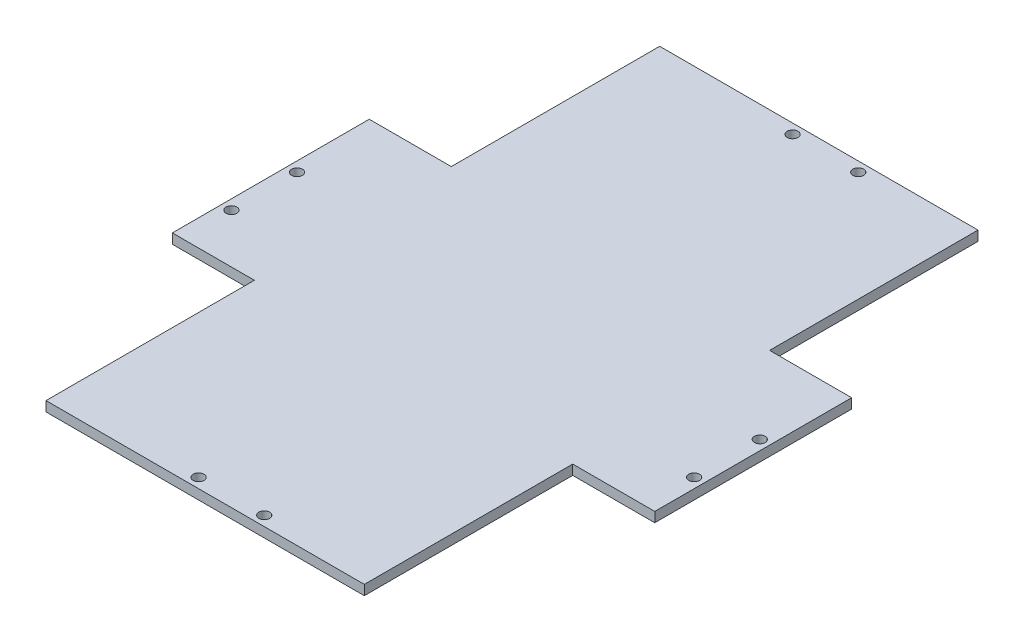
ISO-10303-21;
HEADER;
FILE_DESCRIPTION(('STEP AP214'),'2;1');
FILE_NAME('part.step','',(''),(''),'','','');
FILE_SCHEMA(('AUTOMOTIVE_DESIGN { 1 0 10303 214 1 1 1 1 }'));
ENDSEC;
DATA;
#1=APPLICATION_CONTEXT('core data for automotive mechanical design processes');
#2=APPLICATION_PROTOCOL_DEFINITION('international standard','automotive_design',2000,#1);
#3=PRODUCT_CONTEXT('',#1,'mechanical');
#4=PRODUCT('Part','Part','',(#3));
#5=PRODUCT_RELATED_PRODUCT_CATEGORY('part','',(#4));
#6=PRODUCT_DEFINITION_FORMATION('','',#4);
#7=PRODUCT_DEFINITION_CONTEXT('part definition',#1,'design');
#8=PRODUCT_DEFINITION('design','',#6,#7);
#9=PRODUCT_DEFINITION_SHAPE('','',#8);
#10=(LENGTH_UNIT() NAMED_UNIT(*) SI_UNIT(.MILLI.,.METRE.));
#11=(NAMED_UNIT(*) PLANE_ANGLE_UNIT() SI_UNIT($,.RADIAN.));
#12=(NAMED_UNIT(*) SI_UNIT($,.STERADIAN.) SOLID_ANGLE_UNIT());
#13=UNCERTAINTY_MEASURE_WITH_UNIT(LENGTH_MEASURE(1.E-05),#10,'distance_accuracy_value','');
#14=(GEOMETRIC_REPRESENTATION_CONTEXT(3) GLOBAL_UNCERTAINTY_ASSIGNED_CONTEXT((#13)) GLOBAL_UNIT_ASSIGNED_CONTEXT((#10,
#11,#12)) REPRESENTATION_CONTEXT('',''));
#15=CARTESIAN_POINT('',(0.,0.,0.));
#16=DIRECTION('',(0.,0.,1.));
#17=DIRECTION('',(1.,0.,0.));
#18=AXIS2_PLACEMENT_3D('',#15,#16,#17);
#19=CARTESIAN_POINT('',(-48.5,3.,93.5));
#20=DIRECTION('',(1.,0.,0.));
#21=DIRECTION('',(0.,0.,-1.));
#22=AXIS2_PLACEMENT_3D('',#19,#20,#21);
#23=PLANE('',#22);
#24=DIRECTION('',(0.,1.,0.));
#25=VECTOR('',#24,1.);
#26=CARTESIAN_POINT('',(-48.5,0.,30.));
#27=LINE('',#26,#25);
#28=CARTESIAN_POINT('',(-48.5,0.,30.));
#29=VERTEX_POINT('',#28);
#30=CARTESIAN_POINT('',(-48.5,3.,30.));
#31=VERTEX_POINT('',#30);
#32=EDGE_CURVE('E152',#29,#31,#27,.T.);
#33=ORIENTED_EDGE('',*,*,#32,.F.);
#34=DIRECTION('',(0.,0.,1.));
#35=VECTOR('',#34,1.);
#36=CARTESIAN_POINT('',(-48.5,0.,93.5));
#37=LINE('',#36,#35);
#38=CARTESIAN_POINT('',(-48.5,0.,93.5));
#39=VERTEX_POINT('',#38);
#40=EDGE_CURVE('E139',#29,#39,#37,.T.);
#41=ORIENTED_EDGE('',*,*,#40,.T.);
#42=DIRECTION('',(0.,-1.,0.));
#43=VECTOR('',#42,1.);
#44=CARTESIAN_POINT('',(-48.5,3.,93.5));
#45=LINE('',#44,#43);
#46=CARTESIAN_POINT('',(-48.5,3.,93.5));
#47=VERTEX_POINT('',#46);
#48=EDGE_CURVE('E220',#47,#39,#45,.T.);
#49=ORIENTED_EDGE('',*,*,#48,.F.);
#50=DIRECTION('',(0.,0.,1.));
#51=VECTOR('',#50,1.);
#52=CARTESIAN_POINT('',(-48.5,3.,93.5));
#53=LINE('',#52,#51);
#54=EDGE_CURVE('E201',#31,#47,#53,.T.);
#55=ORIENTED_EDGE('',*,*,#54,.F.);
#56=EDGE_LOOP('',(#33,#41,#49,#55));
#57=FACE_BOUND('',#56,.T.);
#58=ADVANCED_FACE('F41',(#57),#23,.F.);
#59=CARTESIAN_POINT('',(48.5,3.,93.5));
#60=DIRECTION('',(-1.,0.,0.));
#61=DIRECTION('',(0.,0.,1.));
#62=AXIS2_PLACEMENT_3D('',#59,#60,#61);
#63=PLANE('',#62);
#64=DIRECTION('',(0.,1.,0.));
#65=VECTOR('',#64,1.);
#66=CARTESIAN_POINT('',(48.5,0.,-30.));
#67=LINE('',#66,#65);
#68=CARTESIAN_POINT('',(48.5,0.,-30.));
#69=VERTEX_POINT('',#68);
#70=CARTESIAN_POINT('',(48.5,3.,-30.));
#71=VERTEX_POINT('',#70);
#72=EDGE_CURVE('E192',#69,#71,#67,.T.);
#73=ORIENTED_EDGE('',*,*,#72,.F.);
#74=DIRECTION('',(0.,0.,-1.));
#75=VECTOR('',#74,1.);
#76=CARTESIAN_POINT('',(48.5,0.,93.5));
#77=LINE('',#76,#75);
#78=CARTESIAN_POINT('',(48.5,0.,-93.5));
#79=VERTEX_POINT('',#78);
#80=EDGE_CURVE('E189',#69,#79,#77,.T.);
#81=ORIENTED_EDGE('',*,*,#80,.T.);
#82=DIRECTION('',(0.,-1.,0.));
#83=VECTOR('',#82,1.);
#84=CARTESIAN_POINT('',(48.5,3.,-93.5));
#85=LINE('',#84,#83);
#86=CARTESIAN_POINT('',(48.5,3.,-93.5));
#87=VERTEX_POINT('',#86);
#88=EDGE_CURVE('E11',#87,#79,#85,.T.);
#89=ORIENTED_EDGE('',*,*,#88,.F.);
#90=DIRECTION('',(0.,0.,-1.));
#91=VECTOR('',#90,1.);
#92=CARTESIAN_POINT('',(48.5,3.,93.5));
#93=LINE('',#92,#91);
#94=EDGE_CURVE('E199',#71,#87,#93,.T.);
#95=ORIENTED_EDGE('',*,*,#94,.F.);
#96=EDGE_LOOP('',(#73,#81,#89,#95));
#97=FACE_BOUND('',#96,.T.);
#98=ADVANCED_FACE('F240',(#97),#63,.F.);
#99=CARTESIAN_POINT('',(48.5,0.,93.5));
#100=VERTEX_POINT('',#99);
#101=CARTESIAN_POINT('',(48.5,0.,30.));
#102=VERTEX_POINT('',#101);
#103=EDGE_CURVE('E208',#100,#102,#77,.T.);
#104=ORIENTED_EDGE('',*,*,#103,.T.);
#105=DIRECTION('',(0.,1.,0.));
#106=VECTOR('',#105,1.);
#107=CARTESIAN_POINT('',(48.5,0.,30.));
#108=LINE('',#107,#106);
#109=CARTESIAN_POINT('',(48.5,3.,30.));
#110=VERTEX_POINT('',#109);
#111=EDGE_CURVE('E190',#102,#110,#108,.T.);
#112=ORIENTED_EDGE('',*,*,#111,.T.);
#113=CARTESIAN_POINT('',(48.5,3.,93.5));
#114=VERTEX_POINT('',#113);
#115=EDGE_CURVE('E195',#114,#110,#93,.T.);
#116=ORIENTED_EDGE('',*,*,#115,.F.);
#117=DIRECTION('',(0.,-1.,0.));
#118=VECTOR('',#117,1.);
#119=CARTESIAN_POINT('',(48.5,3.,93.5));
#120=LINE('',#119,#118);
#121=EDGE_CURVE('E207',#114,#100,#120,.T.);
#122=ORIENTED_EDGE('',*,*,#121,.T.);
#123=EDGE_LOOP('',(#104,#112,#116,#122));
#124=FACE_BOUND('',#123,.T.);
#125=ADVANCED_FACE('F43',(#124),#63,.F.);
#126=CARTESIAN_POINT('',(-48.5,3.,-93.5));
#127=DIRECTION('',(0.,0.,1.));
#128=DIRECTION('',(1.,0.,0.));
#129=AXIS2_PLACEMENT_3D('',#126,#127,#128);
#130=PLANE('',#129);
#131=DIRECTION('',(-1.,0.,0.));
#132=VECTOR('',#131,1.);
#133=CARTESIAN_POINT('',(-48.5,0.,-93.5));
#134=LINE('',#133,#132);
#135=CARTESIAN_POINT('',(-48.5,0.,-93.5));
#136=VERTEX_POINT('',#135);
#137=EDGE_CURVE('E211',#79,#136,#134,.T.);
#138=ORIENTED_EDGE('',*,*,#137,.T.);
#139=DIRECTION('',(0.,-1.,0.));
#140=VECTOR('',#139,1.);
#141=CARTESIAN_POINT('',(-48.5,3.,-93.5));
#142=LINE('',#141,#140);
#143=CARTESIAN_POINT('',(-48.5,3.,-93.5));
#144=VERTEX_POINT('',#143);
#145=EDGE_CURVE('E49',#144,#136,#142,.T.);
#146=ORIENTED_EDGE('',*,*,#145,.F.);
#147=DIRECTION('',(-1.,0.,0.));
#148=VECTOR('',#147,1.);
#149=CARTESIAN_POINT('',(-48.5,3.,-93.5));
#150=LINE('',#149,#148);
#151=EDGE_CURVE('E198',#87,#144,#150,.T.);
#152=ORIENTED_EDGE('',*,*,#151,.F.);
#153=ORIENTED_EDGE('',*,*,#88,.T.);
#154=EDGE_LOOP('',(#138,#146,#152,#153));
#155=FACE_BOUND('',#154,.T.);
#156=ADVANCED_FACE('F237',(#155),#130,.F.);
#157=CARTESIAN_POINT('',(-48.5,0.,-30.));
#158=VERTEX_POINT('',#157);
#159=EDGE_CURVE('E213',#136,#158,#37,.T.);
#160=ORIENTED_EDGE('',*,*,#159,.T.);
#161=DIRECTION('',(0.,1.,0.));
#162=VECTOR('',#161,1.);
#163=CARTESIAN_POINT('',(-48.5,0.,-30.));
#164=LINE('',#163,#162);
#165=CARTESIAN_POINT('',(-48.5,3.,-30.));
#166=VERTEX_POINT('',#165);
#167=EDGE_CURVE('E169',#158,#166,#164,.T.);
#168=ORIENTED_EDGE('',*,*,#167,.T.);
#169=EDGE_CURVE('E202',#144,#166,#53,.T.);
#170=ORIENTED_EDGE('',*,*,#169,.F.);
#171=ORIENTED_EDGE('',*,*,#145,.T.);
#172=EDGE_LOOP('',(#160,#168,#170,#171));
#173=FACE_BOUND('',#172,.T.);
#174=ADVANCED_FACE('F227',(#173),#23,.F.);
#175=CARTESIAN_POINT('',(-48.5,3.,93.5));
#176=DIRECTION('',(0.,0.,-1.));
#177=DIRECTION('',(-1.,0.,0.));
#178=AXIS2_PLACEMENT_3D('',#175,#176,#177);
#179=PLANE('',#178);
#180=DIRECTION('',(1.,0.,0.));
#181=VECTOR('',#180,1.);
#182=CARTESIAN_POINT('',(-48.5,0.,93.5));
#183=LINE('',#182,#181);
#184=EDGE_CURVE('E216',#39,#100,#183,.T.);
#185=ORIENTED_EDGE('',*,*,#184,.T.);
#186=ORIENTED_EDGE('',*,*,#121,.F.);
#187=DIRECTION('',(1.,0.,0.));
#188=VECTOR('',#187,1.);
#189=CARTESIAN_POINT('',(-48.5,3.,93.5));
#190=LINE('',#189,#188);
#191=EDGE_CURVE('E205',#47,#114,#190,.T.);
#192=ORIENTED_EDGE('',*,*,#191,.F.);
#193=ORIENTED_EDGE('',*,*,#48,.T.);
#194=EDGE_LOOP('',(#185,#186,#192,#193));
#195=FACE_BOUND('',#194,.T.);
#196=ADVANCED_FACE('F255',(#195),#179,.F.);
#197=CARTESIAN_POINT('',(0.,3.,0.));
#198=DIRECTION('',(0.,-1.,0.));
#199=DIRECTION('',(0.,0.,-1.));
#200=AXIS2_PLACEMENT_3D('',#197,#198,#199);
#201=PLANE('',#200);
#202=CARTESIAN_POINT('',(-5.,3.,-90.5));
#203=DIRECTION('',(0.,1.,0.));
#204=DIRECTION('',(0.,0.,1.));
#205=AXIS2_PLACEMENT_3D('',#202,#203,#204);
#206=CIRCLE('',#205,1.65);
#207=CARTESIAN_POINT('',(-5.,3.,-88.85));
#208=VERTEX_POINT('',#207);
#209=EDGE_CURVE('E440',#208,#208,#206,.T.);
#210=ORIENTED_EDGE('',*,*,#209,.F.);
#211=EDGE_LOOP('',(#210));
#212=FACE_BOUND('',#211,.T.);
#213=CARTESIAN_POINT('',(-70.5,3.,15.));
#214=DIRECTION('',(0.,1.,0.));
#215=DIRECTION('',(0.,0.,1.));
#216=AXIS2_PLACEMENT_3D('',#213,#214,#215);
#217=CIRCLE('',#216,1.65);
#218=CARTESIAN_POINT('',(-70.5,3.,16.65));
#219=VERTEX_POINT('',#218);
#220=EDGE_CURVE('E446',#219,#219,#217,.T.);
#221=ORIENTED_EDGE('',*,*,#220,.F.);
#222=EDGE_LOOP('',(#221));
#223=FACE_BOUND('',#222,.T.);
#224=CARTESIAN_POINT('',(-70.5,3.,-5.00000000000001));
#225=DIRECTION('',(0.,1.,0.));
#226=DIRECTION('',(0.,0.,1.));
#227=AXIS2_PLACEMENT_3D('',#224,#225,#226);
#228=CIRCLE('',#227,1.65);
#229=CARTESIAN_POINT('',(-70.5,3.,-3.35000000000001));
#230=VERTEX_POINT('',#229);
#231=EDGE_CURVE('E456',#230,#230,#228,.T.);
#232=ORIENTED_EDGE('',*,*,#231,.F.);
#233=EDGE_LOOP('',(#232));
#234=FACE_BOUND('',#233,.T.);
#235=CARTESIAN_POINT('',(15.,3.,-90.5));
#236=DIRECTION('',(0.,1.,0.));
#237=DIRECTION('',(0.,0.,1.));
#238=AXIS2_PLACEMENT_3D('',#235,#236,#237);
#239=CIRCLE('',#238,1.65);
#240=CARTESIAN_POINT('',(15.,3.,-88.85));
#241=VERTEX_POINT('',#240);
#242=EDGE_CURVE('E444',#241,#241,#239,.T.);
#243=ORIENTED_EDGE('',*,*,#242,.F.);
#244=EDGE_LOOP('',(#243));
#245=FACE_BOUND('',#244,.T.);
#246=CARTESIAN_POINT('',(70.5,3.,-5.00000000000001));
#247=DIRECTION('',(0.,1.,0.));
#248=DIRECTION('',(0.,0.,1.));
#249=AXIS2_PLACEMENT_3D('',#246,#247,#248);
#250=CIRCLE('',#249,1.65);
#251=CARTESIAN_POINT('',(70.5,3.,-3.35000000000001));
#252=VERTEX_POINT('',#251);
#253=EDGE_CURVE('E478',#252,#252,#250,.T.);
#254=ORIENTED_EDGE('',*,*,#253,.F.);
#255=EDGE_LOOP('',(#254));
#256=FACE_BOUND('',#255,.T.);
#257=CARTESIAN_POINT('',(70.5,3.,15.));
#258=DIRECTION('',(0.,1.,0.));
#259=DIRECTION('',(0.,0.,1.));
#260=AXIS2_PLACEMENT_3D('',#257,#258,#259);
#261=CIRCLE('',#260,1.65);
#262=CARTESIAN_POINT('',(70.5,3.,16.65));
#263=VERTEX_POINT('',#262);
#264=EDGE_CURVE('E470',#263,#263,#261,.T.);
#265=ORIENTED_EDGE('',*,*,#264,.F.);
#266=EDGE_LOOP('',(#265));
#267=FACE_BOUND('',#266,.T.);
#268=CARTESIAN_POINT('',(15.,3.,90.5));
#269=DIRECTION('',(0.,1.,0.));
#270=DIRECTION('',(0.,0.,1.));
#271=AXIS2_PLACEMENT_3D('',#268,#269,#270);
#272=CIRCLE('',#271,1.65);
#273=CARTESIAN_POINT('',(15.,3.,92.15));
#274=VERTEX_POINT('',#273);
#275=EDGE_CURVE('E461',#274,#274,#272,.T.);
#276=ORIENTED_EDGE('',*,*,#275,.F.);
#277=EDGE_LOOP('',(#276));
#278=FACE_BOUND('',#277,.T.);
#279=CARTESIAN_POINT('',(-5.,3.,90.5));
#280=DIRECTION('',(0.,1.,0.));
#281=DIRECTION('',(0.,0.,1.));
#282=AXIS2_PLACEMENT_3D('',#279,#280,#281);
#283=CIRCLE('',#282,1.65);
#284=CARTESIAN_POINT('',(-5.,3.,92.15));
#285=VERTEX_POINT('',#284);
#286=EDGE_CURVE('E159',#285,#285,#283,.T.);
#287=ORIENTED_EDGE('',*,*,#286,.F.);
#288=EDGE_LOOP('',(#287));
#289=FACE_BOUND('',#288,.T.);
#290=ORIENTED_EDGE('',*,*,#115,.T.);
#291=DIRECTION('',(1.,0.,0.));
#292=VECTOR('',#291,1.);
#293=CARTESIAN_POINT('',(48.5,3.,30.));
#294=LINE('',#293,#292);
#295=CARTESIAN_POINT('',(73.5,3.,30.));
#296=VERTEX_POINT('',#295);
#297=EDGE_CURVE('E64',#110,#296,#294,.T.);
#298=ORIENTED_EDGE('',*,*,#297,.T.);
#299=DIRECTION('',(0.,0.,-1.));
#300=VECTOR('',#299,1.);
#301=CARTESIAN_POINT('',(73.5,3.,30.));
#302=LINE('',#301,#300);
#303=CARTESIAN_POINT('',(73.5,3.,-30.));
#304=VERTEX_POINT('',#303);
#305=EDGE_CURVE('E168',#296,#304,#302,.T.);
#306=ORIENTED_EDGE('',*,*,#305,.T.);
#307=DIRECTION('',(-1.,0.,0.));
#308=VECTOR('',#307,1.);
#309=CARTESIAN_POINT('',(48.5,3.,-30.));
#310=LINE('',#309,#308);
#311=EDGE_CURVE('E183',#304,#71,#310,.T.);
#312=ORIENTED_EDGE('',*,*,#311,.T.);
#313=ORIENTED_EDGE('',*,*,#94,.T.);
#314=ORIENTED_EDGE('',*,*,#151,.T.);
#315=ORIENTED_EDGE('',*,*,#169,.T.);
#316=DIRECTION('',(1.,0.,0.));
#317=VECTOR('',#316,1.);
#318=CARTESIAN_POINT('',(-48.5,3.,-30.));
#319=LINE('',#318,#317);
#320=CARTESIAN_POINT('',(-73.5,3.,-30.));
#321=VERTEX_POINT('',#320);
#322=EDGE_CURVE('E56',#321,#166,#319,.T.);
#323=ORIENTED_EDGE('',*,*,#322,.F.);
#324=DIRECTION('',(0.,0.,-1.));
#325=VECTOR('',#324,1.);
#326=CARTESIAN_POINT('',(-73.5,3.,30.));
#327=LINE('',#326,#325);
#328=CARTESIAN_POINT('',(-73.5,3.,30.));
#329=VERTEX_POINT('',#328);
#330=EDGE_CURVE('E163',#329,#321,#327,.T.);
#331=ORIENTED_EDGE('',*,*,#330,.F.);
#332=DIRECTION('',(-1.,0.,0.));
#333=VECTOR('',#332,1.);
#334=CARTESIAN_POINT('',(-48.5,3.,30.));
#335=LINE('',#334,#333);
#336=EDGE_CURVE('E148',#31,#329,#335,.T.);
#337=ORIENTED_EDGE('',*,*,#336,.F.);
#338=ORIENTED_EDGE('',*,*,#54,.T.);
#339=ORIENTED_EDGE('',*,*,#191,.T.);
#340=EDGE_LOOP('',(#290,#298,#306,#312,#313,#314,#315,#323,#331,#337,#338,#339));
#341=FACE_BOUND('',#340,.T.);
#342=ADVANCED_FACE('F234',(#212,#223,#234,#245,#256,#267,#278,#289,#341),#201,.F.);
#343=CARTESIAN_POINT('',(0.,0.,0.));
#344=DIRECTION('',(0.,-1.,0.));
#345=DIRECTION('',(0.,0.,-1.));
#346=AXIS2_PLACEMENT_3D('',#343,#344,#345);
#347=PLANE('',#346);
#348=CARTESIAN_POINT('',(-5.,0.,-90.5));
#349=DIRECTION('',(0.,1.,0.));
#350=DIRECTION('',(0.,0.,1.));
#351=AXIS2_PLACEMENT_3D('',#348,#349,#350);
#352=CIRCLE('',#351,1.65);
#353=CARTESIAN_POINT('',(-5.,0.,-88.85));
#354=VERTEX_POINT('',#353);
#355=EDGE_CURVE('E437',#354,#354,#352,.T.);
#356=ORIENTED_EDGE('',*,*,#355,.T.);
#357=EDGE_LOOP('',(#356));
#358=FACE_BOUND('',#357,.T.);
#359=CARTESIAN_POINT('',(-70.5,0.,15.));
#360=DIRECTION('',(0.,1.,0.));
#361=DIRECTION('',(0.,0.,1.));
#362=AXIS2_PLACEMENT_3D('',#359,#360,#361);
#363=CIRCLE('',#362,1.65);
#364=CARTESIAN_POINT('',(-70.5,0.,16.65));
#365=VERTEX_POINT('',#364);
#366=EDGE_CURVE('E454',#365,#365,#363,.T.);
#367=ORIENTED_EDGE('',*,*,#366,.T.);
#368=EDGE_LOOP('',(#367));
#369=FACE_BOUND('',#368,.T.);
#370=CARTESIAN_POINT('',(-70.5,0.,-5.00000000000001));
#371=DIRECTION('',(0.,1.,0.));
#372=DIRECTION('',(0.,0.,1.));
#373=AXIS2_PLACEMENT_3D('',#370,#371,#372);
#374=CIRCLE('',#373,1.65);
#375=CARTESIAN_POINT('',(-70.5,0.,-3.35000000000001));
#376=VERTEX_POINT('',#375);
#377=EDGE_CURVE('E449',#376,#376,#374,.T.);
#378=ORIENTED_EDGE('',*,*,#377,.T.);
#379=EDGE_LOOP('',(#378));
#380=FACE_BOUND('',#379,.T.);
#381=CARTESIAN_POINT('',(15.,0.,-90.5));
#382=DIRECTION('',(0.,1.,0.));
#383=DIRECTION('',(0.,0.,1.));
#384=AXIS2_PLACEMENT_3D('',#381,#382,#383);
#385=CIRCLE('',#384,1.65);
#386=CARTESIAN_POINT('',(15.,0.,-88.85));
#387=VERTEX_POINT('',#386);
#388=EDGE_CURVE('E441',#387,#387,#385,.T.);
#389=ORIENTED_EDGE('',*,*,#388,.T.);
#390=EDGE_LOOP('',(#389));
#391=FACE_BOUND('',#390,.T.);
#392=CARTESIAN_POINT('',(70.5,0.,-5.00000000000001));
#393=DIRECTION('',(0.,1.,0.));
#394=DIRECTION('',(0.,0.,1.));
#395=AXIS2_PLACEMENT_3D('',#392,#393,#394);
#396=CIRCLE('',#395,1.65);
#397=CARTESIAN_POINT('',(70.5,0.,-3.35000000000001));
#398=VERTEX_POINT('',#397);
#399=EDGE_CURVE('E481',#398,#398,#396,.T.);
#400=ORIENTED_EDGE('',*,*,#399,.T.);
#401=EDGE_LOOP('',(#400));
#402=FACE_BOUND('',#401,.T.);
#403=CARTESIAN_POINT('',(70.5,0.,15.));
#404=DIRECTION('',(0.,1.,0.));
#405=DIRECTION('',(0.,0.,1.));
#406=AXIS2_PLACEMENT_3D('',#403,#404,#405);
#407=CIRCLE('',#406,1.65);
#408=CARTESIAN_POINT('',(70.5,0.,16.65));
#409=VERTEX_POINT('',#408);
#410=EDGE_CURVE('E475',#409,#409,#407,.T.);
#411=ORIENTED_EDGE('',*,*,#410,.T.);
#412=EDGE_LOOP('',(#411));
#413=FACE_BOUND('',#412,.T.);
#414=CARTESIAN_POINT('',(15.,0.,90.5));
#415=DIRECTION('',(0.,1.,0.));
#416=DIRECTION('',(0.,0.,1.));
#417=AXIS2_PLACEMENT_3D('',#414,#415,#416);
#418=CIRCLE('',#417,1.65);
#419=CARTESIAN_POINT('',(15.,0.,92.15));
#420=VERTEX_POINT('',#419);
#421=EDGE_CURVE('E465',#420,#420,#418,.T.);
#422=ORIENTED_EDGE('',*,*,#421,.T.);
#423=EDGE_LOOP('',(#422));
#424=FACE_BOUND('',#423,.T.);
#425=CARTESIAN_POINT('',(-5.,0.,90.5));
#426=DIRECTION('',(0.,1.,0.));
#427=DIRECTION('',(0.,0.,1.));
#428=AXIS2_PLACEMENT_3D('',#425,#426,#427);
#429=CIRCLE('',#428,1.65);
#430=CARTESIAN_POINT('',(-5.,0.,92.15));
#431=VERTEX_POINT('',#430);
#432=EDGE_CURVE('E165',#431,#431,#429,.T.);
#433=ORIENTED_EDGE('',*,*,#432,.T.);
#434=EDGE_LOOP('',(#433));
#435=FACE_BOUND('',#434,.T.);
#436=ORIENTED_EDGE('',*,*,#103,.F.);
#437=ORIENTED_EDGE('',*,*,#184,.F.);
#438=ORIENTED_EDGE('',*,*,#40,.F.);
#439=DIRECTION('',(-1.,0.,0.));
#440=VECTOR('',#439,1.);
#441=CARTESIAN_POINT('',(-48.5,0.,30.));
#442=LINE('',#441,#440);
#443=CARTESIAN_POINT('',(-73.5,0.,30.));
#444=VERTEX_POINT('',#443);
#445=EDGE_CURVE('E131',#29,#444,#442,.T.);
#446=ORIENTED_EDGE('',*,*,#445,.T.);
#447=DIRECTION('',(0.,0.,-1.));
#448=VECTOR('',#447,1.);
#449=CARTESIAN_POINT('',(-73.5,0.,30.));
#450=LINE('',#449,#448);
#451=CARTESIAN_POINT('',(-73.5,0.,-30.));
#452=VERTEX_POINT('',#451);
#453=EDGE_CURVE('E136',#444,#452,#450,.T.);
#454=ORIENTED_EDGE('',*,*,#453,.T.);
#455=DIRECTION('',(1.,0.,0.));
#456=VECTOR('',#455,1.);
#457=CARTESIAN_POINT('',(-48.5,0.,-30.));
#458=LINE('',#457,#456);
#459=EDGE_CURVE('E142',#452,#158,#458,.T.);
#460=ORIENTED_EDGE('',*,*,#459,.T.);
#461=ORIENTED_EDGE('',*,*,#159,.F.);
#462=ORIENTED_EDGE('',*,*,#137,.F.);
#463=ORIENTED_EDGE('',*,*,#80,.F.);
#464=DIRECTION('',(-1.,0.,0.));
#465=VECTOR('',#464,1.);
#466=CARTESIAN_POINT('',(48.5,0.,-30.));
#467=LINE('',#466,#465);
#468=CARTESIAN_POINT('',(73.5,0.,-30.));
#469=VERTEX_POINT('',#468);
#470=EDGE_CURVE('E175',#469,#69,#467,.T.);
#471=ORIENTED_EDGE('',*,*,#470,.F.);
#472=DIRECTION('',(0.,0.,-1.));
#473=VECTOR('',#472,1.);
#474=CARTESIAN_POINT('',(73.5,0.,30.));
#475=LINE('',#474,#473);
#476=CARTESIAN_POINT('',(73.5,0.,30.));
#477=VERTEX_POINT('',#476);
#478=EDGE_CURVE('E172',#477,#469,#475,.T.);
#479=ORIENTED_EDGE('',*,*,#478,.F.);
#480=DIRECTION('',(1.,0.,0.));
#481=VECTOR('',#480,1.);
#482=CARTESIAN_POINT('',(48.5,0.,30.));
#483=LINE('',#482,#481);
#484=EDGE_CURVE('E177',#102,#477,#483,.T.);
#485=ORIENTED_EDGE('',*,*,#484,.F.);
#486=EDGE_LOOP('',(#436,#437,#438,#446,#454,#460,#461,#462,#463,#471,#479,#485));
#487=FACE_BOUND('',#486,.T.);
#488=ADVANCED_FACE('F134',(#358,#369,#380,#391,#402,#413,#424,#435,#487),#347,.T.);
#489=CARTESIAN_POINT('',(73.5,0.,30.));
#490=DIRECTION('',(1.,0.,0.));
#491=DIRECTION('',(0.,0.,-1.));
#492=AXIS2_PLACEMENT_3D('',#489,#490,#491);
#493=PLANE('',#492);
#494=ORIENTED_EDGE('',*,*,#305,.F.);
#495=DIRECTION('',(0.,1.,0.));
#496=VECTOR('',#495,1.);
#497=CARTESIAN_POINT('',(73.5,0.,30.));
#498=LINE('',#497,#496);
#499=EDGE_CURVE('E187',#477,#296,#498,.T.);
#500=ORIENTED_EDGE('',*,*,#499,.F.);
#501=ORIENTED_EDGE('',*,*,#478,.T.);
#502=DIRECTION('',(0.,1.,0.));
#503=VECTOR('',#502,1.);
#504=CARTESIAN_POINT('',(73.5,0.,-30.));
#505=LINE('',#504,#503);
#506=EDGE_CURVE('E180',#469,#304,#505,.T.);
#507=ORIENTED_EDGE('',*,*,#506,.T.);
#508=EDGE_LOOP('',(#494,#500,#501,#507));
#509=FACE_BOUND('',#508,.T.);
#510=ADVANCED_FACE('F247',(#509),#493,.T.);
#511=CARTESIAN_POINT('',(48.5,0.,30.));
#512=DIRECTION('',(0.,0.,1.));
#513=DIRECTION('',(1.,0.,0.));
#514=AXIS2_PLACEMENT_3D('',#511,#512,#513);
#515=PLANE('',#514);
#516=ORIENTED_EDGE('',*,*,#297,.F.);
#517=ORIENTED_EDGE('',*,*,#111,.F.);
#518=ORIENTED_EDGE('',*,*,#484,.T.);
#519=ORIENTED_EDGE('',*,*,#499,.T.);
#520=EDGE_LOOP('',(#516,#517,#518,#519));
#521=FACE_BOUND('',#520,.T.);
#522=ADVANCED_FACE('F249',(#521),#515,.T.);
#523=CARTESIAN_POINT('',(48.5,0.,-30.));
#524=DIRECTION('',(0.,0.,-1.));
#525=DIRECTION('',(-1.,0.,0.));
#526=AXIS2_PLACEMENT_3D('',#523,#524,#525);
#527=PLANE('',#526);
#528=ORIENTED_EDGE('',*,*,#311,.F.);
#529=ORIENTED_EDGE('',*,*,#506,.F.);
#530=ORIENTED_EDGE('',*,*,#470,.T.);
#531=ORIENTED_EDGE('',*,*,#72,.T.);
#532=EDGE_LOOP('',(#528,#529,#530,#531));
#533=FACE_BOUND('',#532,.T.);
#534=ADVANCED_FACE('F259',(#533),#527,.T.);
#535=CARTESIAN_POINT('',(-73.5,0.,30.));
#536=DIRECTION('',(1.,0.,0.));
#537=DIRECTION('',(0.,0.,-1.));
#538=AXIS2_PLACEMENT_3D('',#535,#536,#537);
#539=PLANE('',#538);
#540=ORIENTED_EDGE('',*,*,#330,.T.);
#541=DIRECTION('',(0.,1.,0.));
#542=VECTOR('',#541,1.);
#543=CARTESIAN_POINT('',(-73.5,0.,-30.));
#544=LINE('',#543,#542);
#545=EDGE_CURVE('E155',#452,#321,#544,.T.);
#546=ORIENTED_EDGE('',*,*,#545,.F.);
#547=ORIENTED_EDGE('',*,*,#453,.F.);
#548=DIRECTION('',(0.,1.,0.));
#549=VECTOR('',#548,1.);
#550=CARTESIAN_POINT('',(-73.5,0.,30.));
#551=LINE('',#550,#549);
#552=EDGE_CURVE('E145',#444,#329,#551,.T.);
#553=ORIENTED_EDGE('',*,*,#552,.T.);
#554=EDGE_LOOP('',(#540,#546,#547,#553));
#555=FACE_BOUND('',#554,.T.);
#556=ADVANCED_FACE('F154',(#555),#539,.F.);
#557=CARTESIAN_POINT('',(-48.5,0.,-30.));
#558=DIRECTION('',(0.,0.,1.));
#559=DIRECTION('',(1.,0.,0.));
#560=AXIS2_PLACEMENT_3D('',#557,#558,#559);
#561=PLANE('',#560);
#562=ORIENTED_EDGE('',*,*,#322,.T.);
#563=ORIENTED_EDGE('',*,*,#167,.F.);
#564=ORIENTED_EDGE('',*,*,#459,.F.);
#565=ORIENTED_EDGE('',*,*,#545,.T.);
#566=EDGE_LOOP('',(#562,#563,#564,#565));
#567=FACE_BOUND('',#566,.T.);
#568=ADVANCED_FACE('F232',(#567),#561,.F.);
#569=CARTESIAN_POINT('',(-48.5,0.,30.));
#570=DIRECTION('',(0.,0.,-1.));
#571=DIRECTION('',(-1.,0.,0.));
#572=AXIS2_PLACEMENT_3D('',#569,#570,#571);
#573=PLANE('',#572);
#574=ORIENTED_EDGE('',*,*,#336,.T.);
#575=ORIENTED_EDGE('',*,*,#552,.F.);
#576=ORIENTED_EDGE('',*,*,#445,.F.);
#577=ORIENTED_EDGE('',*,*,#32,.T.);
#578=EDGE_LOOP('',(#574,#575,#576,#577));
#579=FACE_BOUND('',#578,.T.);
#580=ADVANCED_FACE('F146',(#579),#573,.F.);
#581=CARTESIAN_POINT('',(-5.,0.,90.5));
#582=DIRECTION('',(0.,1.,0.));
#583=DIRECTION('',(0.,0.,1.));
#584=AXIS2_PLACEMENT_3D('',#581,#582,#583);
#585=CYLINDRICAL_SURFACE('',#584,1.65);
#586=ORIENTED_EDGE('',*,*,#432,.F.);
#587=EDGE_LOOP('',(#586));
#588=FACE_BOUND('',#587,.T.);
#589=ORIENTED_EDGE('',*,*,#286,.T.);
#590=EDGE_LOOP('',(#589));
#591=FACE_BOUND('',#590,.T.);
#592=ADVANCED_FACE('F353',(#588,#591),#585,.F.);
#593=CARTESIAN_POINT('',(15.,0.,90.5));
#594=DIRECTION('',(0.,1.,0.));
#595=DIRECTION('',(0.,0.,1.));
#596=AXIS2_PLACEMENT_3D('',#593,#594,#595);
#597=CYLINDRICAL_SURFACE('',#596,1.65);
#598=ORIENTED_EDGE('',*,*,#421,.F.);
#599=EDGE_LOOP('',(#598));
#600=FACE_BOUND('',#599,.T.);
#601=ORIENTED_EDGE('',*,*,#275,.T.);
#602=EDGE_LOOP('',(#601));
#603=FACE_BOUND('',#602,.T.);
#604=ADVANCED_FACE('F361',(#600,#603),#597,.F.);
#605=CARTESIAN_POINT('',(70.5,0.,15.));
#606=DIRECTION('',(0.,1.,0.));
#607=DIRECTION('',(0.,0.,1.));
#608=AXIS2_PLACEMENT_3D('',#605,#606,#607);
#609=CYLINDRICAL_SURFACE('',#608,1.65);
#610=ORIENTED_EDGE('',*,*,#410,.F.);
#611=EDGE_LOOP('',(#610));
#612=FACE_BOUND('',#611,.T.);
#613=ORIENTED_EDGE('',*,*,#264,.T.);
#614=EDGE_LOOP('',(#613));
#615=FACE_BOUND('',#614,.T.);
#616=ADVANCED_FACE('F371',(#612,#615),#609,.F.);
#617=CARTESIAN_POINT('',(70.5,0.,-5.00000000000001));
#618=DIRECTION('',(0.,1.,0.));
#619=DIRECTION('',(0.,0.,1.));
#620=AXIS2_PLACEMENT_3D('',#617,#618,#619);
#621=CYLINDRICAL_SURFACE('',#620,1.65);
#622=ORIENTED_EDGE('',*,*,#399,.F.);
#623=EDGE_LOOP('',(#622));
#624=FACE_BOUND('',#623,.T.);
#625=ORIENTED_EDGE('',*,*,#253,.T.);
#626=EDGE_LOOP('',(#625));
#627=FACE_BOUND('',#626,.T.);
#628=ADVANCED_FACE('F381',(#624,#627),#621,.F.);
#629=CARTESIAN_POINT('',(15.,0.,-90.5));
#630=DIRECTION('',(0.,1.,0.));
#631=DIRECTION('',(0.,0.,1.));
#632=AXIS2_PLACEMENT_3D('',#629,#630,#631);
#633=CYLINDRICAL_SURFACE('',#632,1.65);
#634=ORIENTED_EDGE('',*,*,#388,.F.);
#635=EDGE_LOOP('',(#634));
#636=FACE_BOUND('',#635,.T.);
#637=ORIENTED_EDGE('',*,*,#242,.T.);
#638=EDGE_LOOP('',(#637));
#639=FACE_BOUND('',#638,.T.);
#640=ADVANCED_FACE('F391',(#636,#639),#633,.F.);
#641=CARTESIAN_POINT('',(-70.5,0.,-5.00000000000001));
#642=DIRECTION('',(0.,1.,0.));
#643=DIRECTION('',(0.,0.,1.));
#644=AXIS2_PLACEMENT_3D('',#641,#642,#643);
#645=CYLINDRICAL_SURFACE('',#644,1.65);
#646=ORIENTED_EDGE('',*,*,#377,.F.);
#647=EDGE_LOOP('',(#646));
#648=FACE_BOUND('',#647,.T.);
#649=ORIENTED_EDGE('',*,*,#231,.T.);
#650=EDGE_LOOP('',(#649));
#651=FACE_BOUND('',#650,.T.);
#652=ADVANCED_FACE('F401',(#648,#651),#645,.F.);
#653=CARTESIAN_POINT('',(-70.5,0.,15.));
#654=DIRECTION('',(0.,1.,0.));
#655=DIRECTION('',(0.,0.,1.));
#656=AXIS2_PLACEMENT_3D('',#653,#654,#655);
#657=CYLINDRICAL_SURFACE('',#656,1.65);
#658=ORIENTED_EDGE('',*,*,#366,.F.);
#659=EDGE_LOOP('',(#658));
#660=FACE_BOUND('',#659,.T.);
#661=ORIENTED_EDGE('',*,*,#220,.T.);
#662=EDGE_LOOP('',(#661));
#663=FACE_BOUND('',#662,.T.);
#664=ADVANCED_FACE('F411',(#660,#663),#657,.F.);
#665=CARTESIAN_POINT('',(-5.,0.,-90.5));
#666=DIRECTION('',(0.,1.,0.));
#667=DIRECTION('',(0.,0.,1.));
#668=AXIS2_PLACEMENT_3D('',#665,#666,#667);
#669=CYLINDRICAL_SURFACE('',#668,1.65);
#670=ORIENTED_EDGE('',*,*,#355,.F.);
#671=EDGE_LOOP('',(#670));
#672=FACE_BOUND('',#671,.T.);
#673=ORIENTED_EDGE('',*,*,#209,.T.);
#674=EDGE_LOOP('',(#673));
#675=FACE_BOUND('',#674,.T.);
#676=ADVANCED_FACE('F421',(#672,#675),#669,.F.);
#677=CLOSED_SHELL('',(#58,#98,#125,#156,#174,#196,#342,#488,#510,#522,#534,#556,#568,#580,#592,
#604,#616,#628,#640,#652,#664,#676));
#678=MANIFOLD_SOLID_BREP('B2',#677);
#679=ADVANCED_BREP_SHAPE_REPRESENTATION('',(#18,#678),#14);
#680=SHAPE_DEFINITION_REPRESENTATION(#9,#679);
ENDSEC;
END-ISO-10303-21;
